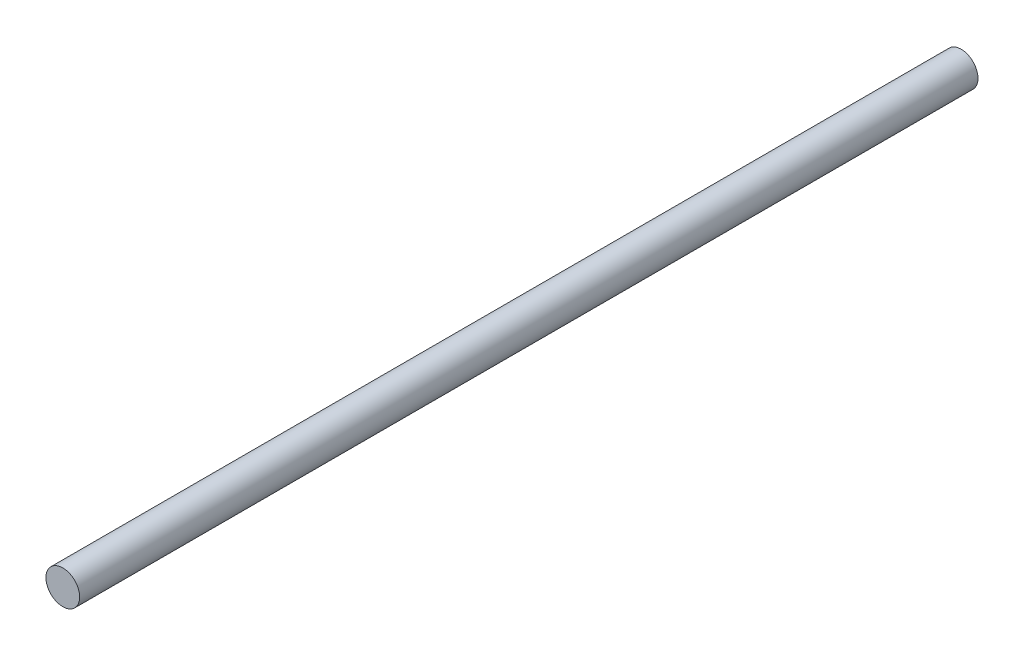
ISO-10303-21;
HEADER;
FILE_DESCRIPTION(('STEP AP214'),'2;1');
FILE_NAME('part.step','',(''),(''),'','','');
FILE_SCHEMA(('AUTOMOTIVE_DESIGN { 1 0 10303 214 1 1 1 1 }'));
ENDSEC;
DATA;
#1=APPLICATION_CONTEXT('core data for automotive mechanical design processes');
#2=APPLICATION_PROTOCOL_DEFINITION('international standard','automotive_design',2000,#1);
#3=PRODUCT_CONTEXT('',#1,'mechanical');
#4=PRODUCT('Part','Part','',(#3));
#5=PRODUCT_RELATED_PRODUCT_CATEGORY('part','',(#4));
#6=PRODUCT_DEFINITION_FORMATION('','',#4);
#7=PRODUCT_DEFINITION_CONTEXT('part definition',#1,'design');
#8=PRODUCT_DEFINITION('design','',#6,#7);
#9=PRODUCT_DEFINITION_SHAPE('','',#8);
#10=(LENGTH_UNIT() NAMED_UNIT(*) SI_UNIT(.MILLI.,.METRE.));
#11=(NAMED_UNIT(*) PLANE_ANGLE_UNIT() SI_UNIT($,.RADIAN.));
#12=(NAMED_UNIT(*) SI_UNIT($,.STERADIAN.) SOLID_ANGLE_UNIT());
#13=UNCERTAINTY_MEASURE_WITH_UNIT(LENGTH_MEASURE(1.E-05),#10,'distance_accuracy_value','');
#14=(GEOMETRIC_REPRESENTATION_CONTEXT(3) GLOBAL_UNCERTAINTY_ASSIGNED_CONTEXT((#13)) GLOBAL_UNIT_ASSIGNED_CONTEXT((#10,
#11,#12)) REPRESENTATION_CONTEXT('',''));
#15=CARTESIAN_POINT('',(0.,0.,0.));
#16=DIRECTION('',(0.,0.,1.));
#17=DIRECTION('',(1.,0.,0.));
#18=AXIS2_PLACEMENT_3D('',#15,#16,#17);
#19=CARTESIAN_POINT('',(0.,0.,200.));
#20=DIRECTION('',(0.,0.,-1.));
#21=DIRECTION('',(-1.,0.,0.));
#22=AXIS2_PLACEMENT_3D('',#19,#20,#21);
#23=CYLINDRICAL_SURFACE('',#22,7.5);
#24=CARTESIAN_POINT('',(0.,0.,200.));
#25=DIRECTION('',(0.,0.,1.));
#26=DIRECTION('',(1.,0.,0.));
#27=AXIS2_PLACEMENT_3D('',#24,#25,#26);
#28=CIRCLE('',#27,7.5);
#29=CARTESIAN_POINT('',(7.5,0.,200.));
#30=VERTEX_POINT('',#29);
#31=EDGE_CURVE('E10',#30,#30,#28,.T.);
#32=ORIENTED_EDGE('',*,*,#31,.F.);
#33=EDGE_LOOP('',(#32));
#34=FACE_BOUND('',#33,.T.);
#35=CARTESIAN_POINT('',(0.,0.,-200.));
#36=DIRECTION('',(0.,0.,1.));
#37=DIRECTION('',(1.,0.,0.));
#38=AXIS2_PLACEMENT_3D('',#35,#36,#37);
#39=CIRCLE('',#38,7.5);
#40=CARTESIAN_POINT('',(7.5,0.,-200.));
#41=VERTEX_POINT('',#40);
#42=EDGE_CURVE('E34',#41,#41,#39,.T.);
#43=ORIENTED_EDGE('',*,*,#42,.T.);
#44=EDGE_LOOP('',(#43));
#45=FACE_BOUND('',#44,.T.);
#46=ADVANCED_FACE('F31',(#34,#45),#23,.T.);
#47=CARTESIAN_POINT('',(0.,0.,200.));
#48=DIRECTION('',(0.,0.,1.));
#49=DIRECTION('',(1.,0.,0.));
#50=AXIS2_PLACEMENT_3D('',#47,#48,#49);
#51=PLANE('',#50);
#52=ORIENTED_EDGE('',*,*,#31,.T.);
#53=EDGE_LOOP('',(#52));
#54=FACE_BOUND('',#53,.T.);
#55=ADVANCED_FACE('F46',(#54),#51,.T.);
#56=CARTESIAN_POINT('',(0.,0.,-200.));
#57=DIRECTION('',(0.,0.,1.));
#58=DIRECTION('',(1.,0.,0.));
#59=AXIS2_PLACEMENT_3D('',#56,#57,#58);
#60=PLANE('',#59);
#61=ORIENTED_EDGE('',*,*,#42,.F.);
#62=EDGE_LOOP('',(#61));
#63=FACE_BOUND('',#62,.T.);
#64=ADVANCED_FACE('F44',(#63),#60,.F.);
#65=CLOSED_SHELL('',(#46,#55,#64));
#66=MANIFOLD_SOLID_BREP('B2',#65);
#67=ADVANCED_BREP_SHAPE_REPRESENTATION('',(#18,#66),#14);
#68=SHAPE_DEFINITION_REPRESENTATION(#9,#67);
ENDSEC;
END-ISO-10303-21;
